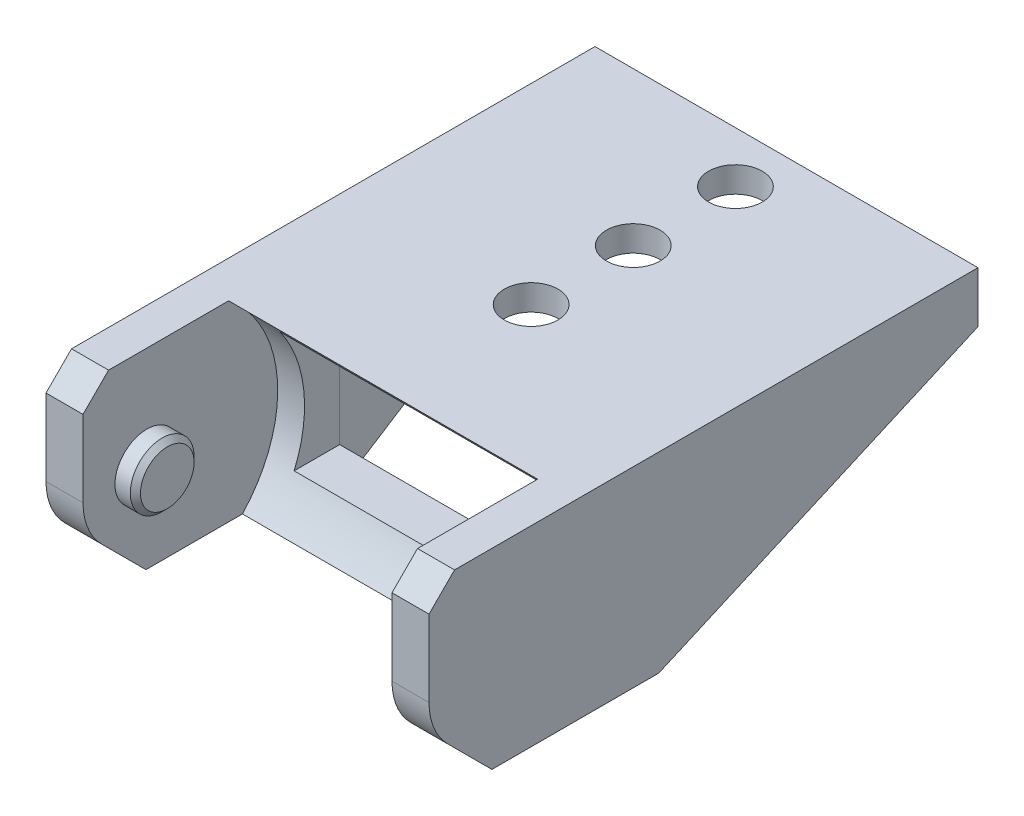
ISO-10303-21;
HEADER;
FILE_DESCRIPTION(('STEP AP214'),'2;1');
FILE_NAME('part.step','',(''),(''),'','','');
FILE_SCHEMA(('AUTOMOTIVE_DESIGN { 1 0 10303 214 1 1 1 1 }'));
ENDSEC;
DATA;
#1=APPLICATION_CONTEXT('core data for automotive mechanical design processes');
#2=APPLICATION_PROTOCOL_DEFINITION('international standard','automotive_design',2000,#1);
#3=PRODUCT_CONTEXT('',#1,'mechanical');
#4=PRODUCT('Part','Part','',(#3));
#5=PRODUCT_RELATED_PRODUCT_CATEGORY('part','',(#4));
#6=PRODUCT_DEFINITION_FORMATION('','',#4);
#7=PRODUCT_DEFINITION_CONTEXT('part definition',#1,'design');
#8=PRODUCT_DEFINITION('design','',#6,#7);
#9=PRODUCT_DEFINITION_SHAPE('','',#8);
#10=(LENGTH_UNIT() NAMED_UNIT(*) SI_UNIT(.MILLI.,.METRE.));
#11=(NAMED_UNIT(*) PLANE_ANGLE_UNIT() SI_UNIT($,.RADIAN.));
#12=(NAMED_UNIT(*) SI_UNIT($,.STERADIAN.) SOLID_ANGLE_UNIT());
#13=UNCERTAINTY_MEASURE_WITH_UNIT(LENGTH_MEASURE(1.E-05),#10,'distance_accuracy_value','');
#14=(GEOMETRIC_REPRESENTATION_CONTEXT(3) GLOBAL_UNCERTAINTY_ASSIGNED_CONTEXT((#13)) GLOBAL_UNIT_ASSIGNED_CONTEXT((#10,
#11,#12)) REPRESENTATION_CONTEXT('',''));
#15=CARTESIAN_POINT('',(0.,0.,0.));
#16=DIRECTION('',(0.,0.,1.));
#17=DIRECTION('',(1.,0.,0.));
#18=AXIS2_PLACEMENT_3D('',#15,#16,#17);
#19=CARTESIAN_POINT('',(0.,0.,0.));
#20=DIRECTION('',(0.,0.,1.));
#21=DIRECTION('',(1.,0.,0.));
#22=AXIS2_PLACEMENT_3D('',#19,#20,#21);
#23=PLANE('',#22);
#24=DIRECTION('',(0.,1.,0.));
#25=VECTOR('',#24,1.);
#26=CARTESIAN_POINT('',(12.2490457011699,3.05027932960895,0.));
#27=LINE('',#26,#25);
#28=CARTESIAN_POINT('',(12.2490457011699,-9.94972067039105,0.));
#29=VERTEX_POINT('',#28);
#30=CARTESIAN_POINT('',(12.2490457011699,-6.94972067039105,0.));
#31=VERTEX_POINT('',#30);
#32=EDGE_CURVE('E236',#29,#31,#27,.T.);
#33=ORIENTED_EDGE('',*,*,#32,.F.);
#34=DIRECTION('',(1.,0.,0.));
#35=VECTOR('',#34,1.);
#36=CARTESIAN_POINT('',(-12.7509542988301,-9.94972067039105,0.));
#37=LINE('',#36,#35);
#38=CARTESIAN_POINT('',(-7.75095429883008,-9.94972067039105,0.));
#39=VERTEX_POINT('',#38);
#40=EDGE_CURVE('E339',#39,#29,#37,.T.);
#41=ORIENTED_EDGE('',*,*,#40,.F.);
#42=DIRECTION('',(0.,-1.,0.));
#43=VECTOR('',#42,1.);
#44=CARTESIAN_POINT('',(-7.75095429883008,3.05027932960895,0.));
#45=LINE('',#44,#43);
#46=CARTESIAN_POINT('',(-7.75095429883008,-6.94972067039105,0.));
#47=VERTEX_POINT('',#46);
#48=EDGE_CURVE('E230',#47,#39,#45,.T.);
#49=ORIENTED_EDGE('',*,*,#48,.F.);
#50=DIRECTION('',(-1.,0.,0.));
#51=VECTOR('',#50,1.);
#52=CARTESIAN_POINT('',(-7.75095429883008,-6.94972067039105,0.));
#53=LINE('',#52,#51);
#54=EDGE_CURVE('E325',#31,#47,#53,.T.);
#55=ORIENTED_EDGE('',*,*,#54,.F.);
#56=EDGE_LOOP('',(#33,#41,#49,#55));
#57=FACE_BOUND('',#56,.T.);
#58=ADVANCED_FACE('F43',(#57),#23,.F.);
#59=CARTESIAN_POINT('',(0.,0.,18.));
#60=DIRECTION('',(0.,0.,1.));
#61=DIRECTION('',(1.,0.,0.));
#62=AXIS2_PLACEMENT_3D('',#59,#60,#61);
#63=PLANE('',#62);
#64=DIRECTION('',(0.,1.,0.));
#65=VECTOR('',#64,1.);
#66=CARTESIAN_POINT('',(-9.85095429883008,0.,18.));
#67=LINE('',#66,#65);
#68=CARTESIAN_POINT('',(-9.85095429883008,-2.94972067039106,18.));
#69=VERTEX_POINT('',#68);
#70=CARTESIAN_POINT('',(-9.85095429883008,3.05027932960895,18.));
#71=VERTEX_POINT('',#70);
#72=EDGE_CURVE('E362',#69,#71,#67,.T.);
#73=ORIENTED_EDGE('',*,*,#72,.T.);
#74=DIRECTION('',(-1.,0.,0.));
#75=VECTOR('',#74,1.);
#76=CARTESIAN_POINT('',(-12.7509542988301,3.05027932960895,18.));
#77=LINE('',#76,#75);
#78=CARTESIAN_POINT('',(-12.7509542988301,3.05027932960895,18.));
#79=VERTEX_POINT('',#78);
#80=EDGE_CURVE('E413',#71,#79,#77,.T.);
#81=ORIENTED_EDGE('',*,*,#80,.T.);
#82=DIRECTION('',(0.,-1.,0.));
#83=VECTOR('',#82,1.);
#84=CARTESIAN_POINT('',(-12.7509542988301,5.05027932960895,18.));
#85=LINE('',#84,#83);
#86=CARTESIAN_POINT('',(-12.7509542988301,-2.94972067039106,18.));
#87=VERTEX_POINT('',#86);
#88=EDGE_CURVE('E340',#79,#87,#85,.T.);
#89=ORIENTED_EDGE('',*,*,#88,.T.);
#90=DIRECTION('',(1.,0.,0.));
#91=VECTOR('',#90,1.);
#92=CARTESIAN_POINT('',(-12.7509542988301,-2.94972067039106,18.));
#93=LINE('',#92,#91);
#94=EDGE_CURVE('E252',#87,#69,#93,.T.);
#95=ORIENTED_EDGE('',*,*,#94,.T.);
#96=EDGE_LOOP('',(#73,#81,#89,#95));
#97=FACE_BOUND('',#96,.T.);
#98=ADVANCED_FACE('F499',(#97),#63,.T.);
#99=CARTESIAN_POINT('',(-12.7509542988301,5.05027932960895,18.));
#100=DIRECTION('',(1.,0.,0.));
#101=DIRECTION('',(0.,1.,0.));
#102=AXIS2_PLACEMENT_3D('',#99,#100,#101);
#103=PLANE('',#102);
#104=DIRECTION('',(0.,1.,0.));
#105=VECTOR('',#104,1.);
#106=CARTESIAN_POINT('',(-12.7509542988301,5.05027932960895,-25.));
#107=LINE('',#106,#105);
#108=CARTESIAN_POINT('',(-12.7509542988301,1.05027932960897,-25.));
#109=VERTEX_POINT('',#108);
#110=CARTESIAN_POINT('',(-12.7509542988301,5.05027932960895,-25.));
#111=VERTEX_POINT('',#110);
#112=EDGE_CURVE('E193',#109,#111,#107,.T.);
#113=ORIENTED_EDGE('',*,*,#112,.F.);
#114=DIRECTION('',(0.,0.402738614266015,-0.915315032422767));
#115=VECTOR('',#114,1.);
#116=CARTESIAN_POINT('',(-12.7509542988301,1.05027932960897,-25.));
#117=LINE('',#116,#115);
#118=CARTESIAN_POINT('',(-12.7509542988301,-9.94972067039105,2.08166817117217E-13));
#119=VERTEX_POINT('',#118);
#120=EDGE_CURVE('E426',#109,#119,#117,.F.);
#121=ORIENTED_EDGE('',*,*,#120,.T.);
#122=DIRECTION('',(0.,0.,-1.));
#123=VECTOR('',#122,1.);
#124=CARTESIAN_POINT('',(-12.7509542988301,-9.94972067039105,18.));
#125=LINE('',#124,#123);
#126=CARTESIAN_POINT('',(-12.7509542988301,-9.94972067039105,13.0710678118654));
#127=VERTEX_POINT('',#126);
#128=EDGE_CURVE('E355',#127,#119,#125,.T.);
#129=ORIENTED_EDGE('',*,*,#128,.F.);
#130=DIRECTION('',(0.,0.707106781186544,0.707106781186551));
#131=VECTOR('',#130,1.);
#132=CARTESIAN_POINT('',(-12.7509542988301,-11.5103942411283,11.5103942411282));
#133=LINE('',#132,#131);
#134=CARTESIAN_POINT('',(-12.7509542988301,-6.48525457632381,16.5355339059327));
#135=VERTEX_POINT('',#134);
#136=EDGE_CURVE('E266',#127,#135,#133,.T.);
#137=ORIENTED_EDGE('',*,*,#136,.T.);
#138=CARTESIAN_POINT('',(-12.7509542988301,-2.94972067039106,13.));
#139=DIRECTION('',(1.,0.,0.));
#140=DIRECTION('',(0.,1.,0.));
#141=AXIS2_PLACEMENT_3D('',#138,#139,#140);
#142=CIRCLE('',#141,5.);
#143=EDGE_CURVE('E244',#87,#135,#142,.T.);
#144=ORIENTED_EDGE('',*,*,#143,.F.);
#145=ORIENTED_EDGE('',*,*,#88,.F.);
#146=DIRECTION('',(0.,0.707106781186546,-0.707106781186549));
#147=VECTOR('',#146,1.);
#148=CARTESIAN_POINT('',(-12.7509542988301,3.05027932960895,18.));
#149=LINE('',#148,#147);
#150=CARTESIAN_POINT('',(-12.7509542988301,5.05027932960895,16.));
#151=VERTEX_POINT('',#150);
#152=EDGE_CURVE('E212',#79,#151,#149,.T.);
#153=ORIENTED_EDGE('',*,*,#152,.T.);
#154=DIRECTION('',(0.,0.,-1.));
#155=VECTOR('',#154,1.);
#156=CARTESIAN_POINT('',(-12.7509542988301,5.05027932960895,18.));
#157=LINE('',#156,#155);
#158=EDGE_CURVE('E209',#151,#111,#157,.T.);
#159=ORIENTED_EDGE('',*,*,#158,.T.);
#160=EDGE_LOOP('',(#113,#121,#129,#137,#144,#145,#153,#159));
#161=FACE_BOUND('',#160,.T.);
#162=ADVANCED_FACE('F210',(#161),#103,.F.);
#163=CARTESIAN_POINT('',(17.2490457011699,5.05027932960895,18.));
#164=DIRECTION('',(-1.,0.,0.));
#165=DIRECTION('',(0.,0.,1.));
#166=AXIS2_PLACEMENT_3D('',#163,#164,#165);
#167=PLANE('',#166);
#168=DIRECTION('',(0.,0.,-1.));
#169=VECTOR('',#168,1.);
#170=CARTESIAN_POINT('',(17.2490457011699,-9.94972067039105,18.));
#171=LINE('',#170,#169);
#172=CARTESIAN_POINT('',(17.2490457011699,-9.94972067039105,13.0710678118654));
#173=VERTEX_POINT('',#172);
#174=CARTESIAN_POINT('',(17.2490457011699,-9.94972067039105,2.08166817117217E-13));
#175=VERTEX_POINT('',#174);
#176=EDGE_CURVE('E351',#173,#175,#171,.T.);
#177=ORIENTED_EDGE('',*,*,#176,.T.);
#178=DIRECTION('',(0.,-0.402738614266015,0.915315032422767));
#179=VECTOR('',#178,1.);
#180=CARTESIAN_POINT('',(17.2490457011699,1.05027932960897,-25.));
#181=LINE('',#180,#179);
#182=CARTESIAN_POINT('',(17.2490457011699,1.05027932960897,-25.));
#183=VERTEX_POINT('',#182);
#184=EDGE_CURVE('E436',#175,#183,#181,.F.);
#185=ORIENTED_EDGE('',*,*,#184,.T.);
#186=DIRECTION('',(0.,-1.,0.));
#187=VECTOR('',#186,1.);
#188=CARTESIAN_POINT('',(17.2490457011699,-9.94972067039105,-25.));
#189=LINE('',#188,#187);
#190=CARTESIAN_POINT('',(17.2490457011699,5.05027932960895,-25.));
#191=VERTEX_POINT('',#190);
#192=EDGE_CURVE('E223',#191,#183,#189,.T.);
#193=ORIENTED_EDGE('',*,*,#192,.F.);
#194=DIRECTION('',(0.,0.,-1.));
#195=VECTOR('',#194,1.);
#196=CARTESIAN_POINT('',(17.2490457011699,5.05027932960895,18.));
#197=LINE('',#196,#195);
#198=CARTESIAN_POINT('',(17.2490457011699,5.05027932960895,16.));
#199=VERTEX_POINT('',#198);
#200=EDGE_CURVE('E216',#199,#191,#197,.T.);
#201=ORIENTED_EDGE('',*,*,#200,.F.);
#202=DIRECTION('',(0.,-0.707106781186546,0.707106781186549));
#203=VECTOR('',#202,1.);
#204=CARTESIAN_POINT('',(17.2490457011699,3.05027932960895,18.));
#205=LINE('',#204,#203);
#206=CARTESIAN_POINT('',(17.2490457011699,3.05027932960895,18.));
#207=VERTEX_POINT('',#206);
#208=EDGE_CURVE('E410',#199,#207,#205,.T.);
#209=ORIENTED_EDGE('',*,*,#208,.T.);
#210=DIRECTION('',(0.,1.,0.));
#211=VECTOR('',#210,1.);
#212=CARTESIAN_POINT('',(17.2490457011699,5.05027932960895,18.));
#213=LINE('',#212,#211);
#214=CARTESIAN_POINT('',(17.2490457011699,-2.94972067039105,18.));
#215=VERTEX_POINT('',#214);
#216=EDGE_CURVE('E217',#215,#207,#213,.T.);
#217=ORIENTED_EDGE('',*,*,#216,.F.);
#218=CARTESIAN_POINT('',(17.2490457011699,-2.94972067039105,13.));
#219=DIRECTION('',(1.,0.,0.));
#220=DIRECTION('',(0.,1.,0.));
#221=AXIS2_PLACEMENT_3D('',#218,#219,#220);
#222=CIRCLE('',#221,5.);
#223=CARTESIAN_POINT('',(17.2490457011699,-6.48525457632381,16.5355339059327));
#224=VERTEX_POINT('',#223);
#225=EDGE_CURVE('E226',#215,#224,#222,.T.);
#226=ORIENTED_EDGE('',*,*,#225,.T.);
#227=DIRECTION('',(0.,0.707106781186544,0.707106781186551));
#228=VECTOR('',#227,1.);
#229=CARTESIAN_POINT('',(17.2490457011699,-11.5103942411283,11.5103942411282));
#230=LINE('',#229,#228);
#231=EDGE_CURVE('E262',#173,#224,#230,.T.);
#232=ORIENTED_EDGE('',*,*,#231,.F.);
#233=EDGE_LOOP('',(#177,#185,#193,#201,#209,#217,#226,#232));
#234=FACE_BOUND('',#233,.T.);
#235=ADVANCED_FACE('F522',(#234),#167,.F.);
#236=ORIENTED_EDGE('',*,*,#216,.T.);
#237=DIRECTION('',(-1.,0.,0.));
#238=VECTOR('',#237,1.);
#239=CARTESIAN_POINT('',(14.3490457011699,3.05027932960895,18.));
#240=LINE('',#239,#238);
#241=CARTESIAN_POINT('',(14.3490457011699,3.05027932960895,18.));
#242=VERTEX_POINT('',#241);
#243=EDGE_CURVE('E397',#207,#242,#240,.T.);
#244=ORIENTED_EDGE('',*,*,#243,.T.);
#245=DIRECTION('',(0.,1.,0.));
#246=VECTOR('',#245,1.);
#247=CARTESIAN_POINT('',(14.3490457011699,0.,18.));
#248=LINE('',#247,#246);
#249=CARTESIAN_POINT('',(14.3490457011699,-2.94972067039105,18.));
#250=VERTEX_POINT('',#249);
#251=EDGE_CURVE('E366',#250,#242,#248,.T.);
#252=ORIENTED_EDGE('',*,*,#251,.F.);
#253=EDGE_CURVE('E247',#250,#215,#93,.T.);
#254=ORIENTED_EDGE('',*,*,#253,.T.);
#255=EDGE_LOOP('',(#236,#244,#252,#254));
#256=FACE_BOUND('',#255,.T.);
#257=ADVANCED_FACE('F525',(#256),#63,.T.);
#258=CARTESIAN_POINT('',(14.3490457011699,0.,0.));
#259=DIRECTION('',(1.,0.,0.));
#260=DIRECTION('',(0.,1.,0.));
#261=AXIS2_PLACEMENT_3D('',#258,#259,#260);
#262=PLANE('',#261);
#263=CARTESIAN_POINT('',(14.3490457011699,-2.94972067039105,13.));
#264=DIRECTION('',(1.,0.,0.));
#265=DIRECTION('',(0.,1.,0.));
#266=AXIS2_PLACEMENT_3D('',#263,#264,#265);
#267=CIRCLE('',#266,2.5);
#268=CARTESIAN_POINT('',(14.3490457011699,-0.449720670391052,13.));
#269=VERTEX_POINT('',#268);
#270=EDGE_CURVE('E370',#269,#269,#267,.F.);
#271=ORIENTED_EDGE('',*,*,#270,.F.);
#272=EDGE_LOOP('',(#271));
#273=FACE_BOUND('',#272,.T.);
#274=ORIENTED_EDGE('',*,*,#251,.T.);
#275=DIRECTION('',(0.,0.707106781186546,-0.707106781186549));
#276=VECTOR('',#275,1.);
#277=CARTESIAN_POINT('',(14.3490457011699,3.05027932960895,18.));
#278=LINE('',#277,#276);
#279=CARTESIAN_POINT('',(14.3490457011699,5.05027932960895,16.));
#280=VERTEX_POINT('',#279);
#281=EDGE_CURVE('E401',#242,#280,#278,.T.);
#282=ORIENTED_EDGE('',*,*,#281,.T.);
#283=DIRECTION('',(0.,0.,1.));
#284=VECTOR('',#283,1.);
#285=CARTESIAN_POINT('',(14.3490457011699,5.05027932960895,18.));
#286=LINE('',#285,#284);
#287=CARTESIAN_POINT('',(14.3490457011699,5.05027932960895,6.59199719101185));
#288=VERTEX_POINT('',#287);
#289=EDGE_CURVE('E315',#288,#280,#286,.T.);
#290=ORIENTED_EDGE('',*,*,#289,.F.);
#291=CARTESIAN_POINT('',(14.3490457011699,-2.94972067039105,13.));
#292=DIRECTION('',(1.,0.,0.));
#293=DIRECTION('',(0.,1.,0.));
#294=AXIS2_PLACEMENT_3D('',#291,#292,#293);
#295=CIRCLE('',#294,10.25);
#296=CARTESIAN_POINT('',(14.3490457011699,-9.94972067039105,5.51251043406403));
#297=VERTEX_POINT('',#296);
#298=EDGE_CURVE('E286',#297,#288,#295,.T.);
#299=ORIENTED_EDGE('',*,*,#298,.F.);
#300=DIRECTION('',(0.,0.,-1.));
#301=VECTOR('',#300,1.);
#302=CARTESIAN_POINT('',(14.3490457011699,-9.94972067039105,18.));
#303=LINE('',#302,#301);
#304=CARTESIAN_POINT('',(14.3490457011699,-9.94972067039105,13.0710678118654));
#305=VERTEX_POINT('',#304);
#306=EDGE_CURVE('E318',#305,#297,#303,.T.);
#307=ORIENTED_EDGE('',*,*,#306,.F.);
#308=DIRECTION('',(0.,0.707106781186544,0.707106781186551));
#309=VECTOR('',#308,1.);
#310=CARTESIAN_POINT('',(14.3490457011699,-11.5103942411283,11.5103942411282));
#311=LINE('',#310,#309);
#312=CARTESIAN_POINT('',(14.3490457011699,-6.48525457632381,16.5355339059327));
#313=VERTEX_POINT('',#312);
#314=EDGE_CURVE('E274',#305,#313,#311,.T.);
#315=ORIENTED_EDGE('',*,*,#314,.T.);
#316=CARTESIAN_POINT('',(14.3490457011699,-2.94972067039105,13.));
#317=DIRECTION('',(1.,0.,0.));
#318=DIRECTION('',(0.,1.,0.));
#319=AXIS2_PLACEMENT_3D('',#316,#317,#318);
#320=CIRCLE('',#319,5.);
#321=EDGE_CURVE('E259',#250,#313,#320,.T.);
#322=ORIENTED_EDGE('',*,*,#321,.F.);
#323=EDGE_LOOP('',(#274,#282,#290,#299,#307,#315,#322));
#324=FACE_BOUND('',#323,.T.);
#325=ADVANCED_FACE('F513',(#273,#324),#262,.F.);
#326=CARTESIAN_POINT('',(-9.85095429883008,0.,0.));
#327=DIRECTION('',(1.,0.,0.));
#328=DIRECTION('',(0.,1.,0.));
#329=AXIS2_PLACEMENT_3D('',#326,#327,#328);
#330=PLANE('',#329);
#331=CARTESIAN_POINT('',(-9.85095429883008,-2.94972067039106,13.));
#332=DIRECTION('',(1.,0.,0.));
#333=DIRECTION('',(0.,1.,0.));
#334=AXIS2_PLACEMENT_3D('',#331,#332,#333);
#335=CIRCLE('',#334,2.5);
#336=CARTESIAN_POINT('',(-9.85095429883008,-0.449720670391055,13.));
#337=VERTEX_POINT('',#336);
#338=EDGE_CURVE('E278',#337,#337,#335,.T.);
#339=ORIENTED_EDGE('',*,*,#338,.F.);
#340=EDGE_LOOP('',(#339));
#341=FACE_BOUND('',#340,.T.);
#342=DIRECTION('',(0.,0.,1.));
#343=VECTOR('',#342,1.);
#344=CARTESIAN_POINT('',(-9.85095429883008,5.05027932960895,18.));
#345=LINE('',#344,#343);
#346=CARTESIAN_POINT('',(-9.85095429883008,5.05027932960895,6.59199719101185));
#347=VERTEX_POINT('',#346);
#348=CARTESIAN_POINT('',(-9.85095429883008,5.05027932960895,16.));
#349=VERTEX_POINT('',#348);
#350=EDGE_CURVE('E308',#347,#349,#345,.T.);
#351=ORIENTED_EDGE('',*,*,#350,.T.);
#352=DIRECTION('',(0.,-0.707106781186546,0.707106781186549));
#353=VECTOR('',#352,1.);
#354=CARTESIAN_POINT('',(-9.85095429883008,10.5251396648045,10.5251396648044));
#355=LINE('',#354,#353);
#356=EDGE_CURVE('E235',#349,#71,#355,.T.);
#357=ORIENTED_EDGE('',*,*,#356,.T.);
#358=ORIENTED_EDGE('',*,*,#72,.F.);
#359=CARTESIAN_POINT('',(-9.85095429883008,-2.94972067039106,13.));
#360=DIRECTION('',(1.,0.,0.));
#361=DIRECTION('',(0.,1.,0.));
#362=AXIS2_PLACEMENT_3D('',#359,#360,#361);
#363=CIRCLE('',#362,5.);
#364=CARTESIAN_POINT('',(-9.85095429883008,-6.48525457632381,16.5355339059327));
#365=VERTEX_POINT('',#364);
#366=EDGE_CURVE('E251',#69,#365,#363,.T.);
#367=ORIENTED_EDGE('',*,*,#366,.T.);
#368=DIRECTION('',(0.,0.707106781186544,0.707106781186551));
#369=VECTOR('',#368,1.);
#370=CARTESIAN_POINT('',(-9.85095429883008,-11.5103942411283,11.5103942411282));
#371=LINE('',#370,#369);
#372=CARTESIAN_POINT('',(-9.85095429883008,-9.94972067039105,13.0710678118654));
#373=VERTEX_POINT('',#372);
#374=EDGE_CURVE('E390',#373,#365,#371,.T.);
#375=ORIENTED_EDGE('',*,*,#374,.F.);
#376=DIRECTION('',(0.,0.,-1.));
#377=VECTOR('',#376,1.);
#378=CARTESIAN_POINT('',(-9.85095429883008,-9.94972067039105,18.));
#379=LINE('',#378,#377);
#380=CARTESIAN_POINT('',(-9.85095429883008,-9.94972067039105,5.51251043406403));
#381=VERTEX_POINT('',#380);
#382=EDGE_CURVE('E312',#373,#381,#379,.T.);
#383=ORIENTED_EDGE('',*,*,#382,.T.);
#384=CARTESIAN_POINT('',(-9.85095429883008,-2.94972067039105,13.));
#385=DIRECTION('',(1.,0.,0.));
#386=DIRECTION('',(0.,1.,0.));
#387=AXIS2_PLACEMENT_3D('',#384,#385,#386);
#388=CIRCLE('',#387,10.25);
#389=EDGE_CURVE('E282',#381,#347,#388,.T.);
#390=ORIENTED_EDGE('',*,*,#389,.T.);
#391=EDGE_LOOP('',(#351,#357,#358,#367,#375,#383,#390));
#392=FACE_BOUND('',#391,.T.);
#393=ADVANCED_FACE('F491',(#341,#392),#330,.T.);
#394=CARTESIAN_POINT('',(-12.7509542988301,-11.5103942411283,11.5103942411282));
#395=DIRECTION('',(0.,0.707106781186551,-0.707106781186544));
#396=DIRECTION('',(0.,0.707106781186544,0.707106781186551));
#397=AXIS2_PLACEMENT_3D('',#394,#395,#396);
#398=PLANE('',#397);
#399=DIRECTION('',(1.,0.,0.));
#400=VECTOR('',#399,1.);
#401=CARTESIAN_POINT('',(-12.7509542988301,-6.48525457632381,16.5355339059327));
#402=LINE('',#401,#400);
#403=EDGE_CURVE('E248',#135,#365,#402,.T.);
#404=ORIENTED_EDGE('',*,*,#403,.F.);
#405=ORIENTED_EDGE('',*,*,#136,.F.);
#406=DIRECTION('',(1.,0.,0.));
#407=VECTOR('',#406,1.);
#408=CARTESIAN_POINT('',(-12.7509542988301,-9.94972067039105,13.0710678118654));
#409=LINE('',#408,#407);
#410=EDGE_CURVE('E271',#127,#373,#409,.T.);
#411=ORIENTED_EDGE('',*,*,#410,.T.);
#412=ORIENTED_EDGE('',*,*,#374,.T.);
#413=EDGE_LOOP('',(#404,#405,#411,#412));
#414=FACE_BOUND('',#413,.T.);
#415=ADVANCED_FACE('F489',(#414),#398,.F.);
#416=DIRECTION('',(1.,0.,0.));
#417=VECTOR('',#416,1.);
#418=CARTESIAN_POINT('',(-12.7509542988301,-6.48525457632381,16.5355339059327));
#419=LINE('',#418,#417);
#420=EDGE_CURVE('E394',#313,#224,#419,.T.);
#421=ORIENTED_EDGE('',*,*,#420,.F.);
#422=ORIENTED_EDGE('',*,*,#314,.F.);
#423=EDGE_CURVE('E270',#305,#173,#409,.T.);
#424=ORIENTED_EDGE('',*,*,#423,.T.);
#425=ORIENTED_EDGE('',*,*,#231,.T.);
#426=EDGE_LOOP('',(#421,#422,#424,#425));
#427=FACE_BOUND('',#426,.T.);
#428=ADVANCED_FACE('F533',(#427),#398,.F.);
#429=CARTESIAN_POINT('',(-7.75095429883008,3.05027932960895,-0.001000000000001));
#430=DIRECTION('',(0.,1.,0.));
#431=DIRECTION('',(0.,0.,1.));
#432=AXIS2_PLACEMENT_3D('',#429,#430,#431);
#433=PLANE('',#432);
#434=CARTESIAN_POINT('',(2.24904570116992,3.05027932960895,-21.));
#435=DIRECTION('',(0.,-1.,0.));
#436=DIRECTION('',(0.,0.,-1.));
#437=AXIS2_PLACEMENT_3D('',#434,#435,#436);
#438=CIRCLE('',#437,2.1);
#439=CARTESIAN_POINT('',(2.24904570116992,3.05027932960895,-23.1));
#440=VERTEX_POINT('',#439);
#441=EDGE_CURVE('E445',#440,#440,#438,.T.);
#442=ORIENTED_EDGE('',*,*,#441,.F.);
#443=EDGE_LOOP('',(#442));
#444=FACE_BOUND('',#443,.T.);
#445=CARTESIAN_POINT('',(2.24904570116992,3.05027932960895,-13.));
#446=DIRECTION('',(0.,-1.,0.));
#447=DIRECTION('',(0.,0.,-1.));
#448=AXIS2_PLACEMENT_3D('',#445,#446,#447);
#449=CIRCLE('',#448,2.1);
#450=CARTESIAN_POINT('',(2.24904570116992,3.05027932960895,-15.1));
#451=VERTEX_POINT('',#450);
#452=EDGE_CURVE('E923',#451,#451,#449,.T.);
#453=ORIENTED_EDGE('',*,*,#452,.F.);
#454=EDGE_LOOP('',(#453));
#455=FACE_BOUND('',#454,.T.);
#456=CARTESIAN_POINT('',(2.24904570116992,3.05027932960895,-5.));
#457=DIRECTION('',(0.,-1.,0.));
#458=DIRECTION('',(0.,0.,-1.));
#459=AXIS2_PLACEMENT_3D('',#456,#457,#458);
#460=CIRCLE('',#459,2.1);
#461=CARTESIAN_POINT('',(2.24904570116992,3.05027932960895,-7.1));
#462=VERTEX_POINT('',#461);
#463=EDGE_CURVE('E926',#462,#462,#460,.T.);
#464=ORIENTED_EDGE('',*,*,#463,.F.);
#465=EDGE_LOOP('',(#464));
#466=FACE_BOUND('',#465,.T.);
#467=DIRECTION('',(-1.,0.,0.));
#468=VECTOR('',#467,1.);
#469=CARTESIAN_POINT('',(14.3490457011699,3.05027932960895,4.68961493070266));
#470=LINE('',#469,#468);
#471=CARTESIAN_POINT('',(-7.75095429883008,3.05027932960894,4.68961493070266));
#472=VERTEX_POINT('',#471);
#473=CARTESIAN_POINT('',(12.2490457011699,3.05027932960895,4.68961493070266));
#474=VERTEX_POINT('',#473);
#475=EDGE_CURVE('E293',#472,#474,#470,.F.);
#476=ORIENTED_EDGE('',*,*,#475,.F.);
#477=DIRECTION('',(0.,0.,1.));
#478=VECTOR('',#477,1.);
#479=CARTESIAN_POINT('',(-7.75095429883008,3.05027932960895,-0.001000000000001));
#480=LINE('',#479,#478);
#481=CARTESIAN_POINT('',(-7.75095429883008,3.05027932960895,7.35522753814166E-13));
#482=VERTEX_POINT('',#481);
#483=EDGE_CURVE('E322',#482,#472,#480,.T.);
#484=ORIENTED_EDGE('',*,*,#483,.F.);
#485=DIRECTION('',(0.119145220618427,0.,0.992876838486922));
#486=VECTOR('',#485,1.);
#487=CARTESIAN_POINT('',(-7.75107259536013,3.05027932960895,-0.000985804416394309));
#488=LINE('',#487,#486);
#489=CARTESIAN_POINT('',(-10.7509542988301,3.05027932960895,-25.));
#490=VERTEX_POINT('',#489);
#491=EDGE_CURVE('E53',#482,#490,#488,.F.);
#492=ORIENTED_EDGE('',*,*,#491,.T.);
#493=DIRECTION('',(-1.,0.,0.));
#494=VECTOR('',#493,1.);
#495=CARTESIAN_POINT('',(12.2490457011699,3.05027932960895,-25.));
#496=LINE('',#495,#494);
#497=CARTESIAN_POINT('',(15.2490457011699,3.05027932960895,-25.));
#498=VERTEX_POINT('',#497);
#499=EDGE_CURVE('E206',#498,#490,#496,.T.);
#500=ORIENTED_EDGE('',*,*,#499,.F.);
#501=DIRECTION('',(0.119145220618427,0.,-0.992876838486922));
#502=VECTOR('',#501,1.);
#503=CARTESIAN_POINT('',(11.9652523257757,3.05027932960895,2.36494479495263));
#504=LINE('',#503,#502);
#505=CARTESIAN_POINT('',(12.2490457011699,3.05027932960895,7.28583859910259E-13));
#506=VERTEX_POINT('',#505);
#507=EDGE_CURVE('E11',#498,#506,#504,.F.);
#508=ORIENTED_EDGE('',*,*,#507,.T.);
#509=DIRECTION('',(0.,0.,1.));
#510=VECTOR('',#509,1.);
#511=CARTESIAN_POINT('',(12.2490457011699,3.05027932960895,-0.001000000000001));
#512=LINE('',#511,#510);
#513=EDGE_CURVE('E326',#506,#474,#512,.T.);
#514=ORIENTED_EDGE('',*,*,#513,.T.);
#515=EDGE_LOOP('',(#476,#484,#492,#500,#508,#514));
#516=FACE_BOUND('',#515,.T.);
#517=ADVANCED_FACE('F473',(#444,#455,#466,#516),#433,.F.);
#518=CARTESIAN_POINT('',(-7.75095429883008,-6.94972067039105,-0.001000000000001));
#519=DIRECTION('',(0.,-1.,0.));
#520=DIRECTION('',(0.,0.,-1.));
#521=AXIS2_PLACEMENT_3D('',#518,#519,#520);
#522=PLANE('',#521);
#523=DIRECTION('',(-1.,0.,0.));
#524=VECTOR('',#523,1.);
#525=CARTESIAN_POINT('',(14.3490457011699,-6.94972067039105,3.56270695591156));
#526=LINE('',#525,#524);
#527=CARTESIAN_POINT('',(12.2490457011699,-6.94972067039105,3.56270695591156));
#528=VERTEX_POINT('',#527);
#529=CARTESIAN_POINT('',(-7.75095429883008,-6.94972067039106,3.56270695591156));
#530=VERTEX_POINT('',#529);
#531=EDGE_CURVE('E359',#528,#530,#526,.T.);
#532=ORIENTED_EDGE('',*,*,#531,.F.);
#533=DIRECTION('',(0.,0.,1.));
#534=VECTOR('',#533,1.);
#535=CARTESIAN_POINT('',(12.2490457011699,-6.94972067039105,-0.001000000000001));
#536=LINE('',#535,#534);
#537=EDGE_CURVE('E329',#31,#528,#536,.T.);
#538=ORIENTED_EDGE('',*,*,#537,.F.);
#539=ORIENTED_EDGE('',*,*,#54,.T.);
#540=DIRECTION('',(0.,0.,1.));
#541=VECTOR('',#540,1.);
#542=CARTESIAN_POINT('',(-7.75095429883008,-6.94972067039105,-0.001000000000001));
#543=LINE('',#542,#541);
#544=EDGE_CURVE('E321',#47,#530,#543,.T.);
#545=ORIENTED_EDGE('',*,*,#544,.T.);
#546=EDGE_LOOP('',(#532,#538,#539,#545));
#547=FACE_BOUND('',#546,.T.);
#548=ADVANCED_FACE('F550',(#547),#522,.F.);
#549=CARTESIAN_POINT('',(-12.7509542988301,-9.94972067039105,18.));
#550=DIRECTION('',(0.,1.,0.));
#551=DIRECTION('',(0.,0.,1.));
#552=AXIS2_PLACEMENT_3D('',#549,#550,#551);
#553=PLANE('',#552);
#554=ORIENTED_EDGE('',*,*,#128,.T.);
#555=DIRECTION('',(1.,0.,0.));
#556=VECTOR('',#555,1.);
#557=CARTESIAN_POINT('',(-12.7509542988301,-9.94972067039105,2.08166817117217E-13));
#558=LINE('',#557,#556);
#559=EDGE_CURVE('E432',#119,#39,#558,.T.);
#560=ORIENTED_EDGE('',*,*,#559,.T.);
#561=ORIENTED_EDGE('',*,*,#40,.T.);
#562=DIRECTION('',(1.,0.,0.));
#563=VECTOR('',#562,1.);
#564=CARTESIAN_POINT('',(-12.7509542988301,-9.94972067039105,2.08166817117217E-13));
#565=LINE('',#564,#563);
#566=EDGE_CURVE('E429',#29,#175,#565,.T.);
#567=ORIENTED_EDGE('',*,*,#566,.T.);
#568=ORIENTED_EDGE('',*,*,#176,.F.);
#569=ORIENTED_EDGE('',*,*,#423,.F.);
#570=ORIENTED_EDGE('',*,*,#306,.T.);
#571=DIRECTION('',(-1.,0.,0.));
#572=VECTOR('',#571,1.);
#573=CARTESIAN_POINT('',(14.3490457011699,-9.94972067039105,5.51251043406403));
#574=LINE('',#573,#572);
#575=EDGE_CURVE('E304',#381,#297,#574,.F.);
#576=ORIENTED_EDGE('',*,*,#575,.F.);
#577=ORIENTED_EDGE('',*,*,#382,.F.);
#578=ORIENTED_EDGE('',*,*,#410,.F.);
#579=EDGE_LOOP('',(#554,#560,#561,#567,#568,#569,#570,#576,#577,#578));
#580=FACE_BOUND('',#579,.T.);
#581=ADVANCED_FACE('F482',(#580),#553,.F.);
#582=CARTESIAN_POINT('',(-12.7509542988301,5.05027932960895,18.));
#583=DIRECTION('',(0.,-1.,0.));
#584=DIRECTION('',(0.,0.,-1.));
#585=AXIS2_PLACEMENT_3D('',#582,#583,#584);
#586=PLANE('',#585);
#587=CARTESIAN_POINT('',(2.24904570116992,5.05027932960895,-21.));
#588=DIRECTION('',(0.,-1.,0.));
#589=DIRECTION('',(0.,0.,-1.));
#590=AXIS2_PLACEMENT_3D('',#587,#588,#589);
#591=CIRCLE('',#590,2.1);
#592=CARTESIAN_POINT('',(2.24904570116992,5.05027932960895,-23.1));
#593=VERTEX_POINT('',#592);
#594=EDGE_CURVE('E240',#593,#593,#591,.T.);
#595=ORIENTED_EDGE('',*,*,#594,.T.);
#596=EDGE_LOOP('',(#595));
#597=FACE_BOUND('',#596,.T.);
#598=CARTESIAN_POINT('',(2.24904570116992,5.05027932960895,-13.));
#599=DIRECTION('',(0.,-1.,0.));
#600=DIRECTION('',(0.,0.,-1.));
#601=AXIS2_PLACEMENT_3D('',#598,#599,#600);
#602=CIRCLE('',#601,2.1);
#603=CARTESIAN_POINT('',(2.24904570116992,5.05027932960895,-15.1));
#604=VERTEX_POINT('',#603);
#605=EDGE_CURVE('E444',#604,#604,#602,.T.);
#606=ORIENTED_EDGE('',*,*,#605,.T.);
#607=EDGE_LOOP('',(#606));
#608=FACE_BOUND('',#607,.T.);
#609=CARTESIAN_POINT('',(2.24904570116992,5.05027932960895,-5.));
#610=DIRECTION('',(0.,-1.,0.));
#611=DIRECTION('',(0.,0.,-1.));
#612=AXIS2_PLACEMENT_3D('',#609,#610,#611);
#613=CIRCLE('',#612,2.1);
#614=CARTESIAN_POINT('',(2.24904570116992,5.05027932960895,-7.1));
#615=VERTEX_POINT('',#614);
#616=EDGE_CURVE('E440',#615,#615,#613,.T.);
#617=ORIENTED_EDGE('',*,*,#616,.T.);
#618=EDGE_LOOP('',(#617));
#619=FACE_BOUND('',#618,.T.);
#620=ORIENTED_EDGE('',*,*,#289,.T.);
#621=DIRECTION('',(1.,0.,0.));
#622=VECTOR('',#621,1.);
#623=CARTESIAN_POINT('',(17.2490457011699,5.05027932960895,16.));
#624=LINE('',#623,#622);
#625=EDGE_CURVE('E407',#280,#199,#624,.T.);
#626=ORIENTED_EDGE('',*,*,#625,.T.);
#627=ORIENTED_EDGE('',*,*,#200,.T.);
#628=DIRECTION('',(1.,0.,0.));
#629=VECTOR('',#628,1.);
#630=CARTESIAN_POINT('',(17.2490457011699,5.05027932960895,-25.));
#631=LINE('',#630,#629);
#632=EDGE_CURVE('E198',#111,#191,#631,.T.);
#633=ORIENTED_EDGE('',*,*,#632,.F.);
#634=ORIENTED_EDGE('',*,*,#158,.F.);
#635=DIRECTION('',(1.,0.,0.));
#636=VECTOR('',#635,1.);
#637=CARTESIAN_POINT('',(-9.85095429883008,5.05027932960895,16.));
#638=LINE('',#637,#636);
#639=EDGE_CURVE('E404',#151,#349,#638,.T.);
#640=ORIENTED_EDGE('',*,*,#639,.T.);
#641=ORIENTED_EDGE('',*,*,#350,.F.);
#642=DIRECTION('',(-1.,0.,0.));
#643=VECTOR('',#642,1.);
#644=CARTESIAN_POINT('',(14.3490457011699,5.05027932960895,6.59199719101185));
#645=LINE('',#644,#643);
#646=EDGE_CURVE('E301',#288,#347,#645,.T.);
#647=ORIENTED_EDGE('',*,*,#646,.F.);
#648=EDGE_LOOP('',(#620,#626,#627,#633,#634,#640,#641,#647));
#649=FACE_BOUND('',#648,.T.);
#650=ADVANCED_FACE('F220',(#597,#608,#619,#649),#586,.F.);
#651=CARTESIAN_POINT('',(-7.75095429883008,3.05027932960895,-0.001000000000001));
#652=DIRECTION('',(-1.,0.,0.));
#653=DIRECTION('',(0.,-1.,0.));
#654=AXIS2_PLACEMENT_3D('',#651,#652,#653);
#655=PLANE('',#654);
#656=ORIENTED_EDGE('',*,*,#544,.F.);
#657=DIRECTION('',(0.,1.,0.));
#658=VECTOR('',#657,1.);
#659=CARTESIAN_POINT('',(-7.75095429883008,3.05027932960895,7.35522753814166E-13));
#660=LINE('',#659,#658);
#661=EDGE_CURVE('E66',#47,#482,#660,.T.);
#662=ORIENTED_EDGE('',*,*,#661,.T.);
#663=ORIENTED_EDGE('',*,*,#483,.T.);
#664=CARTESIAN_POINT('',(-7.75095429883008,-2.94972067039105,13.));
#665=DIRECTION('',(-1.,0.,0.));
#666=DIRECTION('',(0.,-1.,0.));
#667=AXIS2_PLACEMENT_3D('',#664,#665,#666);
#668=CIRCLE('',#667,10.25);
#669=EDGE_CURVE('E297',#530,#472,#668,.F.);
#670=ORIENTED_EDGE('',*,*,#669,.F.);
#671=EDGE_LOOP('',(#656,#662,#663,#670));
#672=FACE_BOUND('',#671,.T.);
#673=ADVANCED_FACE('F553',(#672),#655,.F.);
#674=CARTESIAN_POINT('',(12.2490457011699,3.05027932960895,-0.001000000000001));
#675=DIRECTION('',(1.,0.,0.));
#676=DIRECTION('',(0.,1.,0.));
#677=AXIS2_PLACEMENT_3D('',#674,#675,#676);
#678=PLANE('',#677);
#679=ORIENTED_EDGE('',*,*,#513,.F.);
#680=DIRECTION('',(0.,-1.,0.));
#681=VECTOR('',#680,1.);
#682=CARTESIAN_POINT('',(12.2490457011699,3.05027932960895,7.28583859910259E-13));
#683=LINE('',#682,#681);
#684=EDGE_CURVE('E463',#506,#31,#683,.T.);
#685=ORIENTED_EDGE('',*,*,#684,.T.);
#686=ORIENTED_EDGE('',*,*,#537,.T.);
#687=CARTESIAN_POINT('',(12.2490457011699,-2.94972067039105,13.));
#688=DIRECTION('',(1.,0.,0.));
#689=DIRECTION('',(0.,1.,0.));
#690=AXIS2_PLACEMENT_3D('',#687,#688,#689);
#691=CIRCLE('',#690,10.25);
#692=EDGE_CURVE('E290',#474,#528,#691,.F.);
#693=ORIENTED_EDGE('',*,*,#692,.F.);
#694=EDGE_LOOP('',(#679,#685,#686,#693));
#695=FACE_BOUND('',#694,.T.);
#696=ADVANCED_FACE('F545',(#695),#678,.F.);
#697=CARTESIAN_POINT('',(14.3490457011699,-2.94972067039105,13.));
#698=DIRECTION('',(-1.,0.,0.));
#699=DIRECTION('',(0.,-1.,0.));
#700=AXIS2_PLACEMENT_3D('',#697,#698,#699);
#701=CYLINDRICAL_SURFACE('',#700,10.25);
#702=ORIENTED_EDGE('',*,*,#669,.T.);
#703=ORIENTED_EDGE('',*,*,#475,.T.);
#704=ORIENTED_EDGE('',*,*,#692,.T.);
#705=ORIENTED_EDGE('',*,*,#531,.T.);
#706=EDGE_LOOP('',(#702,#703,#704,#705));
#707=FACE_BOUND('',#706,.T.);
#708=ORIENTED_EDGE('',*,*,#575,.T.);
#709=ORIENTED_EDGE('',*,*,#298,.T.);
#710=ORIENTED_EDGE('',*,*,#646,.T.);
#711=ORIENTED_EDGE('',*,*,#389,.F.);
#712=EDGE_LOOP('',(#708,#709,#710,#711));
#713=FACE_BOUND('',#712,.T.);
#714=ADVANCED_FACE('F507',(#707,#713),#701,.F.);
#715=CARTESIAN_POINT('',(12.7490457011699,-2.94972067039105,13.));
#716=DIRECTION('',(1.,0.,0.));
#717=DIRECTION('',(0.,1.,0.));
#718=AXIS2_PLACEMENT_3D('',#715,#716,#717);
#719=CYLINDRICAL_SURFACE('',#718,2.5);
#720=CARTESIAN_POINT('',(13.1490457011699,-2.94972067039105,13.));
#721=DIRECTION('',(-1.,0.,0.));
#722=DIRECTION('',(0.,0.,1.));
#723=AXIS2_PLACEMENT_3D('',#720,#721,#722);
#724=CIRCLE('',#723,2.5);
#725=CARTESIAN_POINT('',(13.1490457011699,-2.94972067039105,15.5));
#726=VERTEX_POINT('',#725);
#727=EDGE_CURVE('E386',#726,#726,#724,.F.);
#728=ORIENTED_EDGE('',*,*,#727,.T.);
#729=EDGE_LOOP('',(#728));
#730=FACE_BOUND('',#729,.T.);
#731=ORIENTED_EDGE('',*,*,#270,.T.);
#732=EDGE_LOOP('',(#731));
#733=FACE_BOUND('',#732,.T.);
#734=ADVANCED_FACE('F556',(#730,#733),#719,.T.);
#735=CARTESIAN_POINT('',(12.7490457011699,-2.94972067039105,13.));
#736=DIRECTION('',(-1.,0.,0.));
#737=DIRECTION('',(0.,-1.,0.));
#738=AXIS2_PLACEMENT_3D('',#735,#736,#737);
#739=PLANE('',#738);
#740=CARTESIAN_POINT('',(12.7490457011699,-2.94972067039105,13.));
#741=DIRECTION('',(-1.,0.,0.));
#742=DIRECTION('',(0.,-1.,0.));
#743=AXIS2_PLACEMENT_3D('',#740,#741,#742);
#744=CIRCLE('',#743,2.1);
#745=CARTESIAN_POINT('',(12.7490457011699,-5.04972067039106,13.));
#746=VERTEX_POINT('',#745);
#747=EDGE_CURVE('E382',#746,#746,#744,.T.);
#748=ORIENTED_EDGE('',*,*,#747,.T.);
#749=EDGE_LOOP('',(#748));
#750=FACE_BOUND('',#749,.T.);
#751=ADVANCED_FACE('F562',(#750),#739,.T.);
#752=CARTESIAN_POINT('',(-8.25095429883008,-2.94972067039106,13.));
#753=DIRECTION('',(-1.,0.,0.));
#754=DIRECTION('',(0.,-1.,0.));
#755=AXIS2_PLACEMENT_3D('',#752,#753,#754);
#756=CYLINDRICAL_SURFACE('',#755,2.5);
#757=CARTESIAN_POINT('',(-8.65095429883007,-2.94972067039106,13.));
#758=DIRECTION('',(1.,0.,0.));
#759=DIRECTION('',(0.,0.,-1.));
#760=AXIS2_PLACEMENT_3D('',#757,#758,#759);
#761=CIRCLE('',#760,2.5);
#762=CARTESIAN_POINT('',(-8.65095429883007,-2.94972067039106,10.5));
#763=VERTEX_POINT('',#762);
#764=EDGE_CURVE('E378',#763,#763,#761,.F.);
#765=ORIENTED_EDGE('',*,*,#764,.T.);
#766=EDGE_LOOP('',(#765));
#767=FACE_BOUND('',#766,.T.);
#768=ORIENTED_EDGE('',*,*,#338,.T.);
#769=EDGE_LOOP('',(#768));
#770=FACE_BOUND('',#769,.T.);
#771=ADVANCED_FACE('F652',(#767,#770),#756,.T.);
#772=CARTESIAN_POINT('',(-8.25095429883008,-2.94972067039106,13.));
#773=DIRECTION('',(1.,0.,0.));
#774=DIRECTION('',(0.,1.,0.));
#775=AXIS2_PLACEMENT_3D('',#772,#773,#774);
#776=PLANE('',#775);
#777=CARTESIAN_POINT('',(-8.25095429883008,-2.94972067039106,13.));
#778=DIRECTION('',(1.,0.,0.));
#779=DIRECTION('',(0.,1.,0.));
#780=AXIS2_PLACEMENT_3D('',#777,#778,#779);
#781=CIRCLE('',#780,2.10000000000001);
#782=CARTESIAN_POINT('',(-8.25095429883008,-0.849720670391044,13.));
#783=VERTEX_POINT('',#782);
#784=EDGE_CURVE('E374',#783,#783,#781,.T.);
#785=ORIENTED_EDGE('',*,*,#784,.T.);
#786=EDGE_LOOP('',(#785));
#787=FACE_BOUND('',#786,.T.);
#788=ADVANCED_FACE('F593',(#787),#776,.T.);
#789=CARTESIAN_POINT('',(-8.25095429883008,-2.94972067039106,13.));
#790=DIRECTION('',(-1.,0.,0.));
#791=DIRECTION('',(0.,0.,1.));
#792=AXIS2_PLACEMENT_3D('',#789,#790,#791);
#793=CONICAL_SURFACE('',#792,2.10000000000001,0.785398163397444);
#794=ORIENTED_EDGE('',*,*,#764,.F.);
#795=EDGE_LOOP('',(#794));
#796=FACE_BOUND('',#795,.T.);
#797=ORIENTED_EDGE('',*,*,#784,.F.);
#798=EDGE_LOOP('',(#797));
#799=FACE_BOUND('',#798,.T.);
#800=ADVANCED_FACE('F586',(#796,#799),#793,.T.);
#801=CARTESIAN_POINT('',(12.7490457011699,-2.94972067039105,13.));
#802=DIRECTION('',(1.,0.,0.));
#803=DIRECTION('',(0.,0.,-1.));
#804=AXIS2_PLACEMENT_3D('',#801,#802,#803);
#805=CONICAL_SURFACE('',#804,2.1,0.785398163397447);
#806=ORIENTED_EDGE('',*,*,#727,.F.);
#807=EDGE_LOOP('',(#806));
#808=FACE_BOUND('',#807,.T.);
#809=ORIENTED_EDGE('',*,*,#747,.F.);
#810=EDGE_LOOP('',(#809));
#811=FACE_BOUND('',#810,.T.);
#812=ADVANCED_FACE('F592',(#808,#811),#805,.T.);
#813=CARTESIAN_POINT('',(-12.7509542988301,-2.94972067039106,13.));
#814=DIRECTION('',(1.,0.,0.));
#815=DIRECTION('',(0.,1.,0.));
#816=AXIS2_PLACEMENT_3D('',#813,#814,#815);
#817=CYLINDRICAL_SURFACE('',#816,5.);
#818=ORIENTED_EDGE('',*,*,#321,.T.);
#819=ORIENTED_EDGE('',*,*,#420,.T.);
#820=ORIENTED_EDGE('',*,*,#225,.F.);
#821=ORIENTED_EDGE('',*,*,#253,.F.);
#822=EDGE_LOOP('',(#818,#819,#820,#821));
#823=FACE_BOUND('',#822,.T.);
#824=ADVANCED_FACE('F600',(#823),#817,.T.);
#825=ORIENTED_EDGE('',*,*,#94,.F.);
#826=ORIENTED_EDGE('',*,*,#143,.T.);
#827=ORIENTED_EDGE('',*,*,#403,.T.);
#828=ORIENTED_EDGE('',*,*,#366,.F.);
#829=EDGE_LOOP('',(#825,#826,#827,#828));
#830=FACE_BOUND('',#829,.T.);
#831=ADVANCED_FACE('F496',(#830),#817,.T.);
#832=CARTESIAN_POINT('',(0.,3.05027932960895,18.));
#833=DIRECTION('',(0.,0.707106781186549,0.707106781186546));
#834=DIRECTION('',(1.,0.,0.));
#835=AXIS2_PLACEMENT_3D('',#832,#833,#834);
#836=PLANE('',#835);
#837=ORIENTED_EDGE('',*,*,#208,.F.);
#838=ORIENTED_EDGE('',*,*,#625,.F.);
#839=ORIENTED_EDGE('',*,*,#281,.F.);
#840=ORIENTED_EDGE('',*,*,#243,.F.);
#841=EDGE_LOOP('',(#837,#838,#839,#840));
#842=FACE_BOUND('',#841,.T.);
#843=ADVANCED_FACE('F518',(#842),#836,.T.);
#844=CARTESIAN_POINT('',(0.,3.05027932960895,18.));
#845=DIRECTION('',(0.,0.707106781186549,0.707106781186546));
#846=DIRECTION('',(1.,0.,0.));
#847=AXIS2_PLACEMENT_3D('',#844,#845,#846);
#848=PLANE('',#847);
#849=ORIENTED_EDGE('',*,*,#356,.F.);
#850=ORIENTED_EDGE('',*,*,#639,.F.);
#851=ORIENTED_EDGE('',*,*,#152,.F.);
#852=ORIENTED_EDGE('',*,*,#80,.F.);
#853=EDGE_LOOP('',(#849,#850,#851,#852));
#854=FACE_BOUND('',#853,.T.);
#855=ADVANCED_FACE('F503',(#854),#848,.T.);
#856=CARTESIAN_POINT('',(0.,0.,-25.));
#857=DIRECTION('',(0.,0.,1.));
#858=DIRECTION('',(1.,0.,0.));
#859=AXIS2_PLACEMENT_3D('',#856,#857,#858);
#860=PLANE('',#859);
#861=ORIENTED_EDGE('',*,*,#499,.T.);
#862=DIRECTION('',(0.,-1.,0.));
#863=VECTOR('',#862,1.);
#864=CARTESIAN_POINT('',(-10.7509542988301,0.,-25.));
#865=LINE('',#864,#863);
#866=CARTESIAN_POINT('',(-10.7509542988301,1.05027932960897,-25.));
#867=VERTEX_POINT('',#866);
#868=EDGE_CURVE('E455',#490,#867,#865,.T.);
#869=ORIENTED_EDGE('',*,*,#868,.T.);
#870=DIRECTION('',(-1.,0.,0.));
#871=VECTOR('',#870,1.);
#872=CARTESIAN_POINT('',(0.,1.05027932960897,-25.));
#873=LINE('',#872,#871);
#874=EDGE_CURVE('E202',#867,#109,#873,.T.);
#875=ORIENTED_EDGE('',*,*,#874,.T.);
#876=ORIENTED_EDGE('',*,*,#112,.T.);
#877=ORIENTED_EDGE('',*,*,#632,.T.);
#878=ORIENTED_EDGE('',*,*,#192,.T.);
#879=DIRECTION('',(-1.,0.,0.));
#880=VECTOR('',#879,1.);
#881=CARTESIAN_POINT('',(0.,1.05027932960897,-25.));
#882=LINE('',#881,#880);
#883=CARTESIAN_POINT('',(15.2490457011699,1.05027932960897,-25.));
#884=VERTEX_POINT('',#883);
#885=EDGE_CURVE('E234',#183,#884,#882,.T.);
#886=ORIENTED_EDGE('',*,*,#885,.T.);
#887=DIRECTION('',(0.,1.,0.));
#888=VECTOR('',#887,1.);
#889=CARTESIAN_POINT('',(15.2490457011699,0.,-25.));
#890=LINE('',#889,#888);
#891=EDGE_CURVE('E439',#884,#498,#890,.T.);
#892=ORIENTED_EDGE('',*,*,#891,.T.);
#893=EDGE_LOOP('',(#861,#869,#875,#876,#877,#878,#886,#892));
#894=FACE_BOUND('',#893,.T.);
#895=ADVANCED_FACE('F195',(#894),#860,.F.);
#896=CARTESIAN_POINT('',(0.,1.05027932960897,-25.));
#897=DIRECTION('',(0.,0.915315032422767,0.402738614266015));
#898=DIRECTION('',(-1.,0.,0.));
#899=AXIS2_PLACEMENT_3D('',#896,#897,#898);
#900=PLANE('',#899);
#901=ORIENTED_EDGE('',*,*,#874,.F.);
#902=DIRECTION('',(0.109181178787023,-0.400330988885759,0.90984315655855));
#903=VECTOR('',#902,1.);
#904=CARTESIAN_POINT('',(-10.6227972277182,0.580370068865415,-23.932024407401));
#905=LINE('',#904,#903);
#906=EDGE_CURVE('E458',#867,#39,#905,.T.);
#907=ORIENTED_EDGE('',*,*,#906,.T.);
#908=ORIENTED_EDGE('',*,*,#559,.F.);
#909=ORIENTED_EDGE('',*,*,#120,.F.);
#910=EDGE_LOOP('',(#901,#907,#908,#909));
#911=FACE_BOUND('',#910,.T.);
#912=ADVANCED_FACE('F477',(#911),#900,.F.);
#913=CARTESIAN_POINT('',(0.,1.05027932960897,-25.));
#914=DIRECTION('',(0.,0.915315032422767,0.402738614266015));
#915=DIRECTION('',(-1.,0.,0.));
#916=AXIS2_PLACEMENT_3D('',#913,#914,#915);
#917=PLANE('',#916);
#918=ORIENTED_EDGE('',*,*,#566,.F.);
#919=DIRECTION('',(0.109181178787023,0.400330988885759,-0.90984315655855));
#920=VECTOR('',#919,1.);
#921=CARTESIAN_POINT('',(15.0672689974474,0.383764749292951,-23.4851941356454));
#922=LINE('',#921,#920);
#923=EDGE_CURVE('E466',#29,#884,#922,.T.);
#924=ORIENTED_EDGE('',*,*,#923,.T.);
#925=ORIENTED_EDGE('',*,*,#885,.F.);
#926=ORIENTED_EDGE('',*,*,#184,.F.);
#927=EDGE_LOOP('',(#918,#924,#925,#926));
#928=FACE_BOUND('',#927,.T.);
#929=ADVANCED_FACE('F538',(#928),#917,.F.);
#930=CARTESIAN_POINT('',(2.24904570116992,18.0502793296089,-5.));
#931=DIRECTION('',(0.,-1.,0.));
#932=DIRECTION('',(0.,0.,-1.));
#933=AXIS2_PLACEMENT_3D('',#930,#931,#932);
#934=CYLINDRICAL_SURFACE('',#933,2.1);
#935=ORIENTED_EDGE('',*,*,#463,.T.);
#936=EDGE_LOOP('',(#935));
#937=FACE_BOUND('',#936,.T.);
#938=ORIENTED_EDGE('',*,*,#616,.F.);
#939=EDGE_LOOP('',(#938));
#940=FACE_BOUND('',#939,.T.);
#941=ADVANCED_FACE('F621',(#937,#940),#934,.F.);
#942=CARTESIAN_POINT('',(2.24904570116992,18.0502793296089,-13.));
#943=DIRECTION('',(0.,-1.,0.));
#944=DIRECTION('',(0.,0.,-1.));
#945=AXIS2_PLACEMENT_3D('',#942,#943,#944);
#946=CYLINDRICAL_SURFACE('',#945,2.1);
#947=ORIENTED_EDGE('',*,*,#452,.T.);
#948=EDGE_LOOP('',(#947));
#949=FACE_BOUND('',#948,.T.);
#950=ORIENTED_EDGE('',*,*,#605,.F.);
#951=EDGE_LOOP('',(#950));
#952=FACE_BOUND('',#951,.T.);
#953=ADVANCED_FACE('F630',(#949,#952),#946,.F.);
#954=CARTESIAN_POINT('',(2.24904570116992,18.0502793296089,-21.));
#955=DIRECTION('',(0.,-1.,0.));
#956=DIRECTION('',(0.,0.,-1.));
#957=AXIS2_PLACEMENT_3D('',#954,#955,#956);
#958=CYLINDRICAL_SURFACE('',#957,2.1);
#959=ORIENTED_EDGE('',*,*,#441,.T.);
#960=EDGE_LOOP('',(#959));
#961=FACE_BOUND('',#960,.T.);
#962=ORIENTED_EDGE('',*,*,#594,.F.);
#963=EDGE_LOOP('',(#962));
#964=FACE_BOUND('',#963,.T.);
#965=ADVANCED_FACE('F625',(#961,#964),#958,.F.);
#966=CARTESIAN_POINT('',(-10.7509542988301,0.,-25.));
#967=DIRECTION('',(-0.992876838486922,0.,0.119145220618427));
#968=DIRECTION('',(0.,-1.,0.));
#969=AXIS2_PLACEMENT_3D('',#966,#967,#968);
#970=PLANE('',#969);
#971=ORIENTED_EDGE('',*,*,#661,.F.);
#972=ORIENTED_EDGE('',*,*,#48,.T.);
#973=ORIENTED_EDGE('',*,*,#906,.F.);
#974=ORIENTED_EDGE('',*,*,#868,.F.);
#975=ORIENTED_EDGE('',*,*,#491,.F.);
#976=EDGE_LOOP('',(#971,#972,#973,#974,#975));
#977=FACE_BOUND('',#976,.T.);
#978=ADVANCED_FACE('F475',(#977),#970,.F.);
#979=CARTESIAN_POINT('',(15.2490457011699,0.,-25.));
#980=DIRECTION('',(0.992876838486922,0.,0.119145220618427));
#981=DIRECTION('',(0.,1.,0.));
#982=AXIS2_PLACEMENT_3D('',#979,#980,#981);
#983=PLANE('',#982);
#984=ORIENTED_EDGE('',*,*,#32,.T.);
#985=ORIENTED_EDGE('',*,*,#684,.F.);
#986=ORIENTED_EDGE('',*,*,#507,.F.);
#987=ORIENTED_EDGE('',*,*,#891,.F.);
#988=ORIENTED_EDGE('',*,*,#923,.F.);
#989=EDGE_LOOP('',(#984,#985,#986,#987,#988));
#990=FACE_BOUND('',#989,.T.);
#991=ADVANCED_FACE('F46',(#990),#983,.F.);
#992=CLOSED_SHELL('',(#58,#98,#162,#235,#257,#325,#393,#415,#428,#517,#548,#581,#650,#673,#696,
#714,#734,#751,#771,#788,#800,#812,#824,#831,#843,#855,#895,#912,#929,#941,#953,#965,#978,#991));
#993=MANIFOLD_SOLID_BREP('B2',#992);
#994=ADVANCED_BREP_SHAPE_REPRESENTATION('',(#18,#993),#14);
#995=SHAPE_DEFINITION_REPRESENTATION(#9,#994);
ENDSEC;
END-ISO-10303-21;
